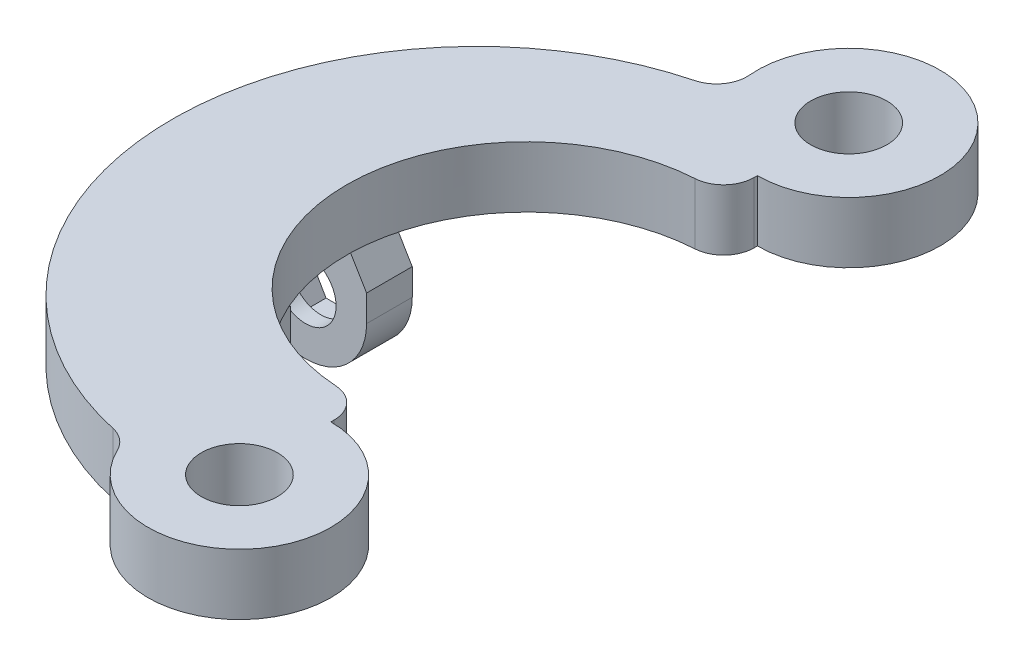
ISO-10303-21;
HEADER;
FILE_DESCRIPTION(('STEP AP214'),'2;1');
FILE_NAME('part.step','',(''),(''),'','','');
FILE_SCHEMA(('AUTOMOTIVE_DESIGN { 1 0 10303 214 1 1 1 1 }'));
ENDSEC;
DATA;
#1=APPLICATION_CONTEXT('core data for automotive mechanical design processes');
#2=APPLICATION_PROTOCOL_DEFINITION('international standard','automotive_design',2000,#1);
#3=PRODUCT_CONTEXT('',#1,'mechanical');
#4=PRODUCT('Part','Part','',(#3));
#5=PRODUCT_RELATED_PRODUCT_CATEGORY('part','',(#4));
#6=PRODUCT_DEFINITION_FORMATION('','',#4);
#7=PRODUCT_DEFINITION_CONTEXT('part definition',#1,'design');
#8=PRODUCT_DEFINITION('design','',#6,#7);
#9=PRODUCT_DEFINITION_SHAPE('','',#8);
#10=(LENGTH_UNIT() NAMED_UNIT(*) SI_UNIT(.MILLI.,.METRE.));
#11=(NAMED_UNIT(*) PLANE_ANGLE_UNIT() SI_UNIT($,.RADIAN.));
#12=(NAMED_UNIT(*) SI_UNIT($,.STERADIAN.) SOLID_ANGLE_UNIT());
#13=UNCERTAINTY_MEASURE_WITH_UNIT(LENGTH_MEASURE(1.E-05),#10,'distance_accuracy_value','');
#14=(GEOMETRIC_REPRESENTATION_CONTEXT(3) GLOBAL_UNCERTAINTY_ASSIGNED_CONTEXT((#13)) GLOBAL_UNIT_ASSIGNED_CONTEXT((#10,
#11,#12)) REPRESENTATION_CONTEXT('',''));
#15=CARTESIAN_POINT('',(0.,0.,0.));
#16=DIRECTION('',(0.,0.,1.));
#17=DIRECTION('',(1.,0.,0.));
#18=AXIS2_PLACEMENT_3D('',#15,#16,#17);
#19=CARTESIAN_POINT('',(7.00000000000001,1.77089805895925,23.7588900000001));
#20=DIRECTION('',(1.,0.,0.));
#21=DIRECTION('',(0.,0.,-1.));
#22=AXIS2_PLACEMENT_3D('',#19,#20,#21);
#23=PLANE('',#22);
#24=DIRECTION('',(0.,0.,-1.));
#25=VECTOR('',#24,1.);
#26=CARTESIAN_POINT('',(7.00000000000001,5.77089805895925,23.7588900000001));
#27=LINE('',#26,#25);
#28=CARTESIAN_POINT('',(6.99999999999995,5.77089805895925,-4.0244528735884));
#29=VERTEX_POINT('',#28);
#30=CARTESIAN_POINT('',(6.99999999999995,5.77089805895925,-4.24110999999981));
#31=VERTEX_POINT('',#30);
#32=EDGE_CURVE('E333',#29,#31,#27,.T.);
#33=ORIENTED_EDGE('',*,*,#32,.F.);
#34=DIRECTION('',(0.,-1.,0.));
#35=VECTOR('',#34,1.);
#36=CARTESIAN_POINT('',(6.99999999999995,1.77089805895924,-4.0244528735884));
#37=LINE('',#36,#35);
#38=CARTESIAN_POINT('',(6.99999999999995,1.77089805895925,-4.0244528735884));
#39=VERTEX_POINT('',#38);
#40=EDGE_CURVE('E374',#29,#39,#37,.T.);
#41=ORIENTED_EDGE('',*,*,#40,.T.);
#42=DIRECTION('',(0.,0.,-1.));
#43=VECTOR('',#42,1.);
#44=CARTESIAN_POINT('',(7.00000000000001,1.77089805895925,23.7588900000001));
#45=LINE('',#44,#43);
#46=CARTESIAN_POINT('',(6.99999999999995,1.77089805895925,-4.24110999999981));
#47=VERTEX_POINT('',#46);
#48=EDGE_CURVE('E322',#39,#47,#45,.T.);
#49=ORIENTED_EDGE('',*,*,#48,.T.);
#50=DIRECTION('',(0.,1.,0.));
#51=VECTOR('',#50,1.);
#52=CARTESIAN_POINT('',(6.99999999999995,1.77089805895925,-4.24110999999981));
#53=LINE('',#52,#51);
#54=EDGE_CURVE('E338',#47,#31,#53,.T.);
#55=ORIENTED_EDGE('',*,*,#54,.T.);
#56=EDGE_LOOP('',(#33,#41,#49,#55));
#57=FACE_BOUND('',#56,.T.);
#58=ADVANCED_FACE('F32',(#57),#23,.T.);
#59=CARTESIAN_POINT('',(-8.91305160522469,-1.66053485870361,14.5));
#60=DIRECTION('',(0.,0.,1.));
#61=DIRECTION('',(1.,0.,0.));
#62=AXIS2_PLACEMENT_3D('',#59,#60,#61);
#63=PLANE('',#62);
#64=CARTESIAN_POINT('',(-8.91305160522469,-1.66053485870361,14.5));
#65=DIRECTION('',(0.,0.,1.));
#66=DIRECTION('',(1.,0.,0.));
#67=AXIS2_PLACEMENT_3D('',#64,#65,#66);
#68=CIRCLE('',#67,4.00000000000001);
#69=CARTESIAN_POINT('',(-12.9130516052247,-1.66053485870361,14.5));
#70=VERTEX_POINT('',#69);
#71=CARTESIAN_POINT('',(-4.91305160522469,-1.66053485870361,14.5));
#72=VERTEX_POINT('',#71);
#73=EDGE_CURVE('E272',#70,#72,#68,.T.);
#74=ORIENTED_EDGE('',*,*,#73,.F.);
#75=DIRECTION('',(0.,-1.,0.));
#76=VECTOR('',#75,1.);
#77=CARTESIAN_POINT('',(-12.9130516052247,1.77089805895931,14.5));
#78=LINE('',#77,#76);
#79=CARTESIAN_POINT('',(-12.9130516052247,1.77089805895931,14.5));
#80=VERTEX_POINT('',#79);
#81=EDGE_CURVE('E284',#80,#70,#78,.T.);
#82=ORIENTED_EDGE('',*,*,#81,.F.);
#83=CARTESIAN_POINT('',(-4.91305160522469,1.77089805895931,14.5));
#84=CARTESIAN_POINT('',(-12.9130516052247,1.77089805895931,14.5));
#85=B_SPLINE_CURVE_WITH_KNOTS('',1,(#83,#84),.UNSPECIFIED.,.F.,.F.,(2,2),(0.,1.),.UNSPECIFIED.);
#86=CARTESIAN_POINT('',(-4.97155154017328,1.77089805895924,14.5));
#87=VERTEX_POINT('',#86);
#88=EDGE_CURVE('E279',#87,#80,#85,.T.);
#89=ORIENTED_EDGE('',*,*,#88,.F.);
#90=CARTESIAN_POINT('',(-4.91305160522469,1.77089805895927,14.5));
#91=VERTEX_POINT('',#90);
#92=EDGE_CURVE('E280',#91,#87,#85,.T.);
#93=ORIENTED_EDGE('',*,*,#92,.F.);
#94=DIRECTION('',(0.,1.,0.));
#95=VECTOR('',#94,1.);
#96=CARTESIAN_POINT('',(-4.91305160522469,-1.66053485870361,14.5));
#97=LINE('',#96,#95);
#98=EDGE_CURVE('E275',#72,#91,#97,.T.);
#99=ORIENTED_EDGE('',*,*,#98,.F.);
#100=EDGE_LOOP('',(#74,#82,#89,#93,#99));
#101=FACE_BOUND('',#100,.T.);
#102=CARTESIAN_POINT('',(-8.91305160522469,-1.72910194104063,14.5));
#103=DIRECTION('',(0.,0.,-1.));
#104=DIRECTION('',(-1.,0.,0.));
#105=AXIS2_PLACEMENT_3D('',#102,#103,#104);
#106=CIRCLE('',#105,1.99999999999997);
#107=CARTESIAN_POINT('',(-10.9130516052247,-1.72910194104063,14.5));
#108=VERTEX_POINT('',#107);
#109=EDGE_CURVE('E219',#108,#108,#106,.T.);
#110=ORIENTED_EDGE('',*,*,#109,.F.);
#111=EDGE_LOOP('',(#110));
#112=FACE_BOUND('',#111,.T.);
#113=ADVANCED_FACE('F504',(#101,#112),#63,.F.);
#114=CARTESIAN_POINT('',(4.58488464355469,1.77089805895925,11.7612838745118));
#115=DIRECTION('',(0.,1.,0.));
#116=DIRECTION('',(0.,0.,1.));
#117=AXIS2_PLACEMENT_3D('',#114,#115,#116);
#118=PLANE('',#117);
#119=CARTESIAN_POINT('',(6.99999999999999,1.77089805895925,29.7588900000001));
#120=DIRECTION('',(0.,1.,0.));
#121=DIRECTION('',(0.,0.,1.));
#122=AXIS2_PLACEMENT_3D('',#119,#120,#121);
#123=CIRCLE('',#122,2.49999999999998);
#124=CARTESIAN_POINT('',(6.99999999999999,1.77089805895925,32.2588900000001));
#125=VERTEX_POINT('',#124);
#126=EDGE_CURVE('E349',#125,#125,#123,.T.);
#127=ORIENTED_EDGE('',*,*,#126,.T.);
#128=EDGE_LOOP('',(#127));
#129=FACE_BOUND('',#128,.T.);
#130=CARTESIAN_POINT('',(6.99999999999999,1.77089805895925,-10.2411099999999));
#131=DIRECTION('',(0.,1.,0.));
#132=DIRECTION('',(0.,0.,1.));
#133=AXIS2_PLACEMENT_3D('',#130,#131,#132);
#134=CIRCLE('',#133,2.49999999999998);
#135=CARTESIAN_POINT('',(6.99999999999999,1.77089805895925,-7.74110999999994));
#136=VERTEX_POINT('',#135);
#137=EDGE_CURVE('E344',#136,#136,#134,.T.);
#138=ORIENTED_EDGE('',*,*,#137,.T.);
#139=EDGE_LOOP('',(#138));
#140=FACE_BOUND('',#139,.T.);
#141=CARTESIAN_POINT('',(5.84409713745117,1.77089805895924,9.75888999999987));
#142=DIRECTION('',(0.,1.,0.));
#143=DIRECTION('',(0.,0.,1.));
#144=AXIS2_PLACEMENT_3D('',#141,#142,#143);
#145=CIRCLE('',#144,11.8091650996123);
#146=CARTESIAN_POINT('',(-4.91305160522469,1.77089805895924,14.6312745576727));
#147=VERTEX_POINT('',#146);
#148=CARTESIAN_POINT('',(5.12225172649649,1.77089805895924,21.5459727413988));
#149=VERTEX_POINT('',#148);
#150=EDGE_CURVE('E223',#147,#149,#145,.T.);
#151=ORIENTED_EDGE('',*,*,#150,.T.);
#152=CARTESIAN_POINT('',(5.00000000000003,1.77089805895925,23.5422328735881));
#153=DIRECTION('',(0.,1.,0.));
#154=DIRECTION('',(0.,0.,1.));
#155=AXIS2_PLACEMENT_3D('',#152,#153,#154);
#156=CIRCLE('',#155,1.99999999999998);
#157=CARTESIAN_POINT('',(7.00000000000001,1.77089805895925,23.5422328735881));
#158=VERTEX_POINT('',#157);
#159=EDGE_CURVE('E368',#149,#158,#156,.F.);
#160=ORIENTED_EDGE('',*,*,#159,.T.);
#161=CARTESIAN_POINT('',(7.00000000000001,1.77089805895925,23.7588900000001));
#162=VERTEX_POINT('',#161);
#163=EDGE_CURVE('E323',#162,#158,#45,.T.);
#164=ORIENTED_EDGE('',*,*,#163,.F.);
#165=CARTESIAN_POINT('',(6.99999999999999,1.77089805895925,29.7588900000001));
#166=DIRECTION('',(0.,1.,0.));
#167=DIRECTION('',(0.,0.,1.));
#168=AXIS2_PLACEMENT_3D('',#165,#166,#167);
#169=CIRCLE('',#168,5.99999999999998);
#170=CARTESIAN_POINT('',(1.59538059948465,1.77089805895925,32.3646699476497));
#171=VERTEX_POINT('',#170);
#172=EDGE_CURVE('E319',#171,#162,#169,.T.);
#173=ORIENTED_EDGE('',*,*,#172,.F.);
#174=CARTESIAN_POINT('',(-0.206159200687123,1.77089805895925,33.2332632635329));
#175=DIRECTION('',(0.,1.,0.));
#176=DIRECTION('',(0.,0.,1.));
#177=AXIS2_PLACEMENT_3D('',#174,#175,#176);
#178=CIRCLE('',#177,1.99999999999998);
#179=CARTESIAN_POINT('',(0.229390239698494,1.77089805895925,31.2812651372583));
#180=VERTEX_POINT('',#179);
#181=EDGE_CURVE('E378',#171,#180,#178,.T.);
#182=ORIENTED_EDGE('',*,*,#181,.T.);
#183=CARTESIAN_POINT('',(4.58488464355469,1.77089805895925,11.7612838745118));
#184=DIRECTION('',(0.,1.,0.));
#185=DIRECTION('',(0.,0.,1.));
#186=AXIS2_PLACEMENT_3D('',#183,#184,#185);
#187=CIRCLE('',#186,19.9999999999999);
#188=CARTESIAN_POINT('',(-0.463201513317756,1.77089805895925,-7.59115334028859));
#189=VERTEX_POINT('',#188);
#190=EDGE_CURVE('E316',#189,#180,#187,.T.);
#191=ORIENTED_EDGE('',*,*,#190,.F.);
#192=CARTESIAN_POINT('',(-0.968010129004998,1.77089805895925,-9.52639706176861));
#193=DIRECTION('',(0.,1.,0.));
#194=DIRECTION('',(0.,0.,1.));
#195=AXIS2_PLACEMENT_3D('',#192,#193,#194);
#196=CIRCLE('',#195,1.99999999999998);
#197=CARTESIAN_POINT('',(1.02399240324621,1.77089805895925,-9.70507529632644));
#198=VERTEX_POINT('',#197);
#199=EDGE_CURVE('E11',#189,#198,#196,.T.);
#200=ORIENTED_EDGE('',*,*,#199,.T.);
#201=CARTESIAN_POINT('',(6.99999999999999,1.77089805895925,-10.2411099999999));
#202=DIRECTION('',(0.,1.,0.));
#203=DIRECTION('',(0.,0.,1.));
#204=AXIS2_PLACEMENT_3D('',#201,#202,#203);
#205=CIRCLE('',#204,6.0000000000001);
#206=EDGE_CURVE('E325',#47,#198,#205,.T.);
#207=ORIENTED_EDGE('',*,*,#206,.F.);
#208=ORIENTED_EDGE('',*,*,#48,.F.);
#209=CARTESIAN_POINT('',(4.99999999999997,1.77089805895925,-4.0244528735884));
#210=DIRECTION('',(0.,1.,0.));
#211=DIRECTION('',(0.,0.,1.));
#212=AXIS2_PLACEMENT_3D('',#209,#210,#211);
#213=CIRCLE('',#212,1.99999999999998);
#214=CARTESIAN_POINT('',(5.12225172649644,1.77089805895924,-2.02819274139907));
#215=VERTEX_POINT('',#214);
#216=EDGE_CURVE('E215',#39,#215,#213,.F.);
#217=ORIENTED_EDGE('',*,*,#216,.T.);
#218=CARTESIAN_POINT('',(-5.96222982387771,1.77089805895924,9.50000000000008));
#219=VERTEX_POINT('',#218);
#220=EDGE_CURVE('E206',#215,#219,#145,.T.);
#221=ORIENTED_EDGE('',*,*,#220,.T.);
#222=DIRECTION('',(0.,0.,1.));
#223=VECTOR('',#222,1.);
#224=CARTESIAN_POINT('',(-5.9622298183957,1.77089805895928,6.50000000000007));
#225=LINE('',#224,#223);
#226=CARTESIAN_POINT('',(-5.9622298183957,1.77089805895928,6.50000000000007));
#227=VERTEX_POINT('',#226);
#228=EDGE_CURVE('E212',#227,#219,#225,.T.);
#229=ORIENTED_EDGE('',*,*,#228,.F.);
#230=CARTESIAN_POINT('',(-5.9622298183957,1.77089805895928,6.50000000000007));
#231=CARTESIAN_POINT('',(-12.9130516052246,1.77089805895928,6.50000000000007));
#232=B_SPLINE_CURVE_WITH_KNOTS('',1,(#230,#231),.UNSPECIFIED.,.F.,.F.,(2,2),(0.,1.),.UNSPECIFIED.);
#233=CARTESIAN_POINT('',(-12.9130516052246,1.77089805895928,6.50000000000007));
#234=VERTEX_POINT('',#233);
#235=EDGE_CURVE('E472',#227,#234,#232,.T.);
#236=ORIENTED_EDGE('',*,*,#235,.T.);
#237=DIRECTION('',(0.,0.,1.));
#238=VECTOR('',#237,1.);
#239=CARTESIAN_POINT('',(-12.9130516052246,1.77089805895928,6.50000000000007));
#240=LINE('',#239,#238);
#241=CARTESIAN_POINT('',(-12.9130516052246,1.77089805895928,9.50000000000008));
#242=VERTEX_POINT('',#241);
#243=EDGE_CURVE('E249',#234,#242,#240,.T.);
#244=ORIENTED_EDGE('',*,*,#243,.T.);
#245=CARTESIAN_POINT('',(-5.9622298183957,1.77089805895928,9.50000000000008));
#246=CARTESIAN_POINT('',(-12.9130516052246,1.77089805895928,9.50000000000008));
#247=B_SPLINE_CURVE_WITH_KNOTS('',1,(#245,#246),.UNSPECIFIED.,.F.,.F.,(2,2),(0.,1.),.UNSPECIFIED.);
#248=EDGE_CURVE('E239',#219,#242,#247,.T.);
#249=ORIENTED_EDGE('',*,*,#248,.F.);
#250=EDGE_CURVE('E220',#219,#87,#145,.T.);
#251=ORIENTED_EDGE('',*,*,#250,.T.);
#252=ORIENTED_EDGE('',*,*,#88,.T.);
#253=DIRECTION('',(0.,0.,1.));
#254=VECTOR('',#253,1.);
#255=CARTESIAN_POINT('',(-12.9130516052247,1.77089805895931,14.5));
#256=LINE('',#255,#254);
#257=CARTESIAN_POINT('',(-12.9130516052247,1.77089805895931,17.5));
#258=VERTEX_POINT('',#257);
#259=EDGE_CURVE('E308',#80,#258,#256,.T.);
#260=ORIENTED_EDGE('',*,*,#259,.T.);
#261=CARTESIAN_POINT('',(-4.91305160522469,1.77089805895931,17.5));
#262=CARTESIAN_POINT('',(-12.9130516052247,1.77089805895931,17.5));
#263=B_SPLINE_CURVE_WITH_KNOTS('',1,(#261,#262),.UNSPECIFIED.,.F.,.F.,(2,2),(0.,1.),.UNSPECIFIED.);
#264=CARTESIAN_POINT('',(-4.91305160522468,1.77089805895925,17.5));
#265=VERTEX_POINT('',#264);
#266=EDGE_CURVE('E296',#265,#258,#263,.T.);
#267=ORIENTED_EDGE('',*,*,#266,.F.);
#268=DIRECTION('',(0.,0.,1.));
#269=VECTOR('',#268,1.);
#270=CARTESIAN_POINT('',(-4.91305160522469,1.77089805895931,14.5));
#271=LINE('',#270,#269);
#272=EDGE_CURVE('E314',#147,#265,#271,.T.);
#273=ORIENTED_EDGE('',*,*,#272,.F.);
#274=EDGE_LOOP('',(#151,#160,#164,#173,#182,#191,#200,#207,#208,#217,#221,#229,#236,#244,#249,
#251,#252,#260,#267,#273));
#275=FACE_BOUND('',#274,.T.);
#276=ADVANCED_FACE('F209',(#129,#140,#275),#118,.F.);
#277=CARTESIAN_POINT('',(4.58488464355469,1.77089805895925,11.7612838745118));
#278=DIRECTION('',(0.,1.,0.));
#279=DIRECTION('',(0.,0.,1.));
#280=AXIS2_PLACEMENT_3D('',#277,#278,#279);
#281=CYLINDRICAL_SURFACE('',#280,19.9999999999999);
#282=ORIENTED_EDGE('',*,*,#190,.T.);
#283=DIRECTION('',(0.,1.,0.));
#284=VECTOR('',#283,1.);
#285=CARTESIAN_POINT('',(0.229390239698493,1.77089805895925,31.2812651372583));
#286=LINE('',#285,#284);
#287=CARTESIAN_POINT('',(0.229390239698494,5.77089805895925,31.2812651372583));
#288=VERTEX_POINT('',#287);
#289=EDGE_CURVE('E354',#180,#288,#286,.T.);
#290=ORIENTED_EDGE('',*,*,#289,.T.);
#291=CARTESIAN_POINT('',(4.58488464355469,5.77089805895925,11.7612838745118));
#292=DIRECTION('',(0.,1.,0.));
#293=DIRECTION('',(0.,0.,1.));
#294=AXIS2_PLACEMENT_3D('',#291,#292,#293);
#295=CIRCLE('',#294,19.9999999999999);
#296=CARTESIAN_POINT('',(-0.463201513317756,5.77089805895925,-7.59115334028859));
#297=VERTEX_POINT('',#296);
#298=EDGE_CURVE('E307',#297,#288,#295,.T.);
#299=ORIENTED_EDGE('',*,*,#298,.F.);
#300=DIRECTION('',(0.,1.,0.));
#301=VECTOR('',#300,1.);
#302=CARTESIAN_POINT('',(-0.463201513317755,1.77089805895925,-7.59115334028859));
#303=LINE('',#302,#301);
#304=EDGE_CURVE('E341',#297,#189,#303,.F.);
#305=ORIENTED_EDGE('',*,*,#304,.T.);
#306=EDGE_LOOP('',(#282,#290,#299,#305));
#307=FACE_BOUND('',#306,.T.);
#308=ADVANCED_FACE('F387',(#307),#281,.T.);
#309=CARTESIAN_POINT('',(6.99999999999999,1.77089805895925,-10.2411099999999));
#310=DIRECTION('',(0.,1.,0.));
#311=DIRECTION('',(0.,0.,1.));
#312=AXIS2_PLACEMENT_3D('',#309,#310,#311);
#313=CYLINDRICAL_SURFACE('',#312,6.0000000000001);
#314=ORIENTED_EDGE('',*,*,#206,.T.);
#315=DIRECTION('',(0.,1.,0.));
#316=VECTOR('',#315,1.);
#317=CARTESIAN_POINT('',(1.02399240324621,1.77089805895925,-9.70507529632644));
#318=LINE('',#317,#316);
#319=CARTESIAN_POINT('',(1.02399240324621,5.77089805895925,-9.70507529632644));
#320=VERTEX_POINT('',#319);
#321=EDGE_CURVE('E359',#198,#320,#318,.T.);
#322=ORIENTED_EDGE('',*,*,#321,.T.);
#323=CARTESIAN_POINT('',(6.99999999999999,5.77089805895925,-10.2411099999999));
#324=DIRECTION('',(0.,1.,0.));
#325=DIRECTION('',(0.,0.,1.));
#326=AXIS2_PLACEMENT_3D('',#323,#324,#325);
#327=CIRCLE('',#326,6.0000000000001);
#328=EDGE_CURVE('E320',#31,#320,#327,.T.);
#329=ORIENTED_EDGE('',*,*,#328,.F.);
#330=ORIENTED_EDGE('',*,*,#54,.F.);
#331=EDGE_LOOP('',(#314,#322,#329,#330));
#332=FACE_BOUND('',#331,.T.);
#333=ADVANCED_FACE('F395',(#332),#313,.T.);
#334=ORIENTED_EDGE('',*,*,#163,.T.);
#335=DIRECTION('',(0.,-1.,0.));
#336=VECTOR('',#335,1.);
#337=CARTESIAN_POINT('',(7.00000000000001,5.77089805895925,23.5422328735881));
#338=LINE('',#337,#336);
#339=CARTESIAN_POINT('',(7.00000000000001,5.77089805895925,23.5422328735881));
#340=VERTEX_POINT('',#339);
#341=EDGE_CURVE('E55',#158,#340,#338,.F.);
#342=ORIENTED_EDGE('',*,*,#341,.T.);
#343=CARTESIAN_POINT('',(7.00000000000001,5.77089805895925,23.7588900000001));
#344=VERTEX_POINT('',#343);
#345=EDGE_CURVE('E334',#344,#340,#27,.T.);
#346=ORIENTED_EDGE('',*,*,#345,.F.);
#347=DIRECTION('',(0.,1.,0.));
#348=VECTOR('',#347,1.);
#349=CARTESIAN_POINT('',(7.00000000000001,1.77089805895925,23.7588900000001));
#350=LINE('',#349,#348);
#351=EDGE_CURVE('E328',#162,#344,#350,.T.);
#352=ORIENTED_EDGE('',*,*,#351,.F.);
#353=EDGE_LOOP('',(#334,#342,#346,#352));
#354=FACE_BOUND('',#353,.T.);
#355=ADVANCED_FACE('F506',(#354),#23,.T.);
#356=CARTESIAN_POINT('',(6.99999999999999,1.77089805895925,29.7588900000001));
#357=DIRECTION('',(0.,1.,0.));
#358=DIRECTION('',(0.,0.,1.));
#359=AXIS2_PLACEMENT_3D('',#356,#357,#358);
#360=CYLINDRICAL_SURFACE('',#359,5.99999999999998);
#361=CARTESIAN_POINT('',(6.99999999999999,5.77089805895925,29.7588900000001));
#362=DIRECTION('',(0.,1.,0.));
#363=DIRECTION('',(0.,0.,1.));
#364=AXIS2_PLACEMENT_3D('',#361,#362,#363);
#365=CIRCLE('',#364,5.99999999999998);
#366=CARTESIAN_POINT('',(1.59538059948465,5.77089805895925,32.3646699476497));
#367=VERTEX_POINT('',#366);
#368=EDGE_CURVE('E331',#367,#344,#365,.T.);
#369=ORIENTED_EDGE('',*,*,#368,.F.);
#370=DIRECTION('',(0.,1.,0.));
#371=VECTOR('',#370,1.);
#372=CARTESIAN_POINT('',(1.59538059948465,1.77089805895925,32.3646699476497));
#373=LINE('',#372,#371);
#374=EDGE_CURVE('E357',#367,#171,#373,.F.);
#375=ORIENTED_EDGE('',*,*,#374,.T.);
#376=ORIENTED_EDGE('',*,*,#172,.T.);
#377=ORIENTED_EDGE('',*,*,#351,.T.);
#378=EDGE_LOOP('',(#369,#375,#376,#377));
#379=FACE_BOUND('',#378,.T.);
#380=ADVANCED_FACE('F515',(#379),#360,.T.);
#381=CARTESIAN_POINT('',(4.58488464355469,5.77089805895925,11.7612838745118));
#382=DIRECTION('',(0.,1.,0.));
#383=DIRECTION('',(0.,0.,1.));
#384=AXIS2_PLACEMENT_3D('',#381,#382,#383);
#385=PLANE('',#384);
#386=ORIENTED_EDGE('',*,*,#345,.T.);
#387=CARTESIAN_POINT('',(5.00000000000003,5.77089805895925,23.5422328735881));
#388=DIRECTION('',(0.,1.,0.));
#389=DIRECTION('',(0.,0.,1.));
#390=AXIS2_PLACEMENT_3D('',#387,#388,#389);
#391=CIRCLE('',#390,1.99999999999998);
#392=CARTESIAN_POINT('',(5.12225172649649,5.77089805895925,21.5459727413988));
#393=VERTEX_POINT('',#392);
#394=EDGE_CURVE('E372',#340,#393,#391,.T.);
#395=ORIENTED_EDGE('',*,*,#394,.T.);
#396=CARTESIAN_POINT('',(5.84409713745117,5.77089805895925,9.75888999999987));
#397=DIRECTION('',(0.,1.,0.));
#398=DIRECTION('',(0.,0.,1.));
#399=AXIS2_PLACEMENT_3D('',#396,#397,#398);
#400=CIRCLE('',#399,11.8091650996123);
#401=CARTESIAN_POINT('',(5.12225172649644,5.77089805895925,-2.02819274139907));
#402=VERTEX_POINT('',#401);
#403=EDGE_CURVE('E399',#402,#393,#400,.T.);
#404=ORIENTED_EDGE('',*,*,#403,.F.);
#405=CARTESIAN_POINT('',(4.99999999999997,5.77089805895925,-4.0244528735884));
#406=DIRECTION('',(0.,1.,0.));
#407=DIRECTION('',(0.,0.,1.));
#408=AXIS2_PLACEMENT_3D('',#405,#406,#407);
#409=CIRCLE('',#408,1.99999999999998);
#410=EDGE_CURVE('E47',#402,#29,#409,.T.);
#411=ORIENTED_EDGE('',*,*,#410,.T.);
#412=ORIENTED_EDGE('',*,*,#32,.T.);
#413=ORIENTED_EDGE('',*,*,#328,.T.);
#414=CARTESIAN_POINT('',(-0.968010129004998,5.77089805895925,-9.52639706176861));
#415=DIRECTION('',(0.,1.,0.));
#416=DIRECTION('',(0.,0.,1.));
#417=AXIS2_PLACEMENT_3D('',#414,#415,#416);
#418=CIRCLE('',#417,1.99999999999998);
#419=EDGE_CURVE('E40',#320,#297,#418,.F.);
#420=ORIENTED_EDGE('',*,*,#419,.T.);
#421=ORIENTED_EDGE('',*,*,#298,.T.);
#422=CARTESIAN_POINT('',(-0.206159200687123,5.77089805895925,33.2332632635329));
#423=DIRECTION('',(0.,1.,0.));
#424=DIRECTION('',(0.,0.,1.));
#425=AXIS2_PLACEMENT_3D('',#422,#423,#424);
#426=CIRCLE('',#425,1.99999999999998);
#427=EDGE_CURVE('E376',#288,#367,#426,.F.);
#428=ORIENTED_EDGE('',*,*,#427,.T.);
#429=ORIENTED_EDGE('',*,*,#368,.T.);
#430=EDGE_LOOP('',(#386,#395,#404,#411,#412,#413,#420,#421,#428,#429));
#431=FACE_BOUND('',#430,.T.);
#432=CARTESIAN_POINT('',(6.99999999999999,5.77089805895925,29.7588900000001));
#433=DIRECTION('',(0.,1.,0.));
#434=DIRECTION('',(0.,0.,1.));
#435=AXIS2_PLACEMENT_3D('',#432,#433,#434);
#436=CIRCLE('',#435,2.49999999999997);
#437=CARTESIAN_POINT('',(6.99999999999999,5.77089805895925,32.2588900000001));
#438=VERTEX_POINT('',#437);
#439=EDGE_CURVE('E352',#438,#438,#436,.T.);
#440=ORIENTED_EDGE('',*,*,#439,.F.);
#441=EDGE_LOOP('',(#440));
#442=FACE_BOUND('',#441,.T.);
#443=CARTESIAN_POINT('',(6.99999999999999,5.77089805895925,-10.2411099999999));
#444=DIRECTION('',(0.,1.,0.));
#445=DIRECTION('',(0.,0.,1.));
#446=AXIS2_PLACEMENT_3D('',#443,#444,#445);
#447=CIRCLE('',#446,2.49999999999997);
#448=CARTESIAN_POINT('',(6.99999999999999,5.77089805895925,-7.74110999999994));
#449=VERTEX_POINT('',#448);
#450=EDGE_CURVE('E348',#449,#449,#447,.T.);
#451=ORIENTED_EDGE('',*,*,#450,.F.);
#452=EDGE_LOOP('',(#451));
#453=FACE_BOUND('',#452,.T.);
#454=ADVANCED_FACE('F380',(#431,#442,#453),#385,.T.);
#455=CARTESIAN_POINT('',(-8.91305160522469,-1.66053485870361,14.5));
#456=DIRECTION('',(0.,0.,1.));
#457=DIRECTION('',(1.,0.,0.));
#458=AXIS2_PLACEMENT_3D('',#455,#456,#457);
#459=CYLINDRICAL_SURFACE('',#458,4.00000000000001);
#460=CARTESIAN_POINT('',(-8.91305160522469,-1.66053485870361,17.5));
#461=DIRECTION('',(0.,0.,1.));
#462=DIRECTION('',(1.,0.,0.));
#463=AXIS2_PLACEMENT_3D('',#460,#461,#462);
#464=CIRCLE('',#463,4.00000000000001);
#465=CARTESIAN_POINT('',(-12.9130516052247,-1.66053485870361,17.5));
#466=VERTEX_POINT('',#465);
#467=CARTESIAN_POINT('',(-4.91305160522469,-1.66053485870361,17.5));
#468=VERTEX_POINT('',#467);
#469=EDGE_CURVE('E266',#466,#468,#464,.T.);
#470=ORIENTED_EDGE('',*,*,#469,.F.);
#471=DIRECTION('',(0.,0.,1.));
#472=VECTOR('',#471,1.);
#473=CARTESIAN_POINT('',(-12.9130516052247,-1.66053485870361,14.5));
#474=LINE('',#473,#472);
#475=EDGE_CURVE('E305',#70,#466,#474,.T.);
#476=ORIENTED_EDGE('',*,*,#475,.F.);
#477=ORIENTED_EDGE('',*,*,#73,.T.);
#478=DIRECTION('',(0.,0.,1.));
#479=VECTOR('',#478,1.);
#480=CARTESIAN_POINT('',(-4.91305160522469,-1.66053485870361,14.5));
#481=LINE('',#480,#479);
#482=EDGE_CURVE('E290',#72,#468,#481,.T.);
#483=ORIENTED_EDGE('',*,*,#482,.T.);
#484=EDGE_LOOP('',(#470,#476,#477,#483));
#485=FACE_BOUND('',#484,.T.);
#486=ADVANCED_FACE('F545',(#485),#459,.T.);
#487=CARTESIAN_POINT('',(-12.9130516052247,1.77089805895931,14.5));
#488=DIRECTION('',(-1.,0.,0.));
#489=DIRECTION('',(0.,-1.,0.));
#490=AXIS2_PLACEMENT_3D('',#487,#488,#489);
#491=PLANE('',#490);
#492=DIRECTION('',(0.,-1.,0.));
#493=VECTOR('',#492,1.);
#494=CARTESIAN_POINT('',(-12.9130516052247,1.77089805895931,17.5));
#495=LINE('',#494,#493);
#496=EDGE_CURVE('E276',#258,#466,#495,.T.);
#497=ORIENTED_EDGE('',*,*,#496,.F.);
#498=ORIENTED_EDGE('',*,*,#259,.F.);
#499=ORIENTED_EDGE('',*,*,#81,.T.);
#500=ORIENTED_EDGE('',*,*,#475,.T.);
#501=EDGE_LOOP('',(#497,#498,#499,#500));
#502=FACE_BOUND('',#501,.T.);
#503=ADVANCED_FACE('F541',(#502),#491,.T.);
#504=CARTESIAN_POINT('',(-4.91305160522469,-1.66053485870361,14.5));
#505=DIRECTION('',(1.,0.,0.));
#506=DIRECTION('',(0.,1.,0.));
#507=AXIS2_PLACEMENT_3D('',#504,#505,#506);
#508=PLANE('',#507);
#509=DIRECTION('',(0.,1.,0.));
#510=VECTOR('',#509,1.);
#511=CARTESIAN_POINT('',(-4.91305160522469,-1.66053485870361,17.5));
#512=LINE('',#511,#510);
#513=EDGE_CURVE('E293',#468,#265,#512,.T.);
#514=ORIENTED_EDGE('',*,*,#513,.F.);
#515=ORIENTED_EDGE('',*,*,#482,.F.);
#516=ORIENTED_EDGE('',*,*,#98,.T.);
#517=EDGE_CURVE('E311',#91,#147,#271,.T.);
#518=ORIENTED_EDGE('',*,*,#517,.T.);
#519=ORIENTED_EDGE('',*,*,#272,.T.);
#520=EDGE_LOOP('',(#514,#515,#516,#518,#519));
#521=FACE_BOUND('',#520,.T.);
#522=ADVANCED_FACE('F530',(#521),#508,.T.);
#523=CARTESIAN_POINT('',(-8.91305160522469,-1.66053485870361,17.5));
#524=DIRECTION('',(0.,0.,1.));
#525=DIRECTION('',(1.,0.,0.));
#526=AXIS2_PLACEMENT_3D('',#523,#524,#525);
#527=PLANE('',#526);
#528=CARTESIAN_POINT('',(-8.91305160522469,-1.72910194104063,17.5));
#529=DIRECTION('',(0.,0.,1.));
#530=DIRECTION('',(1.,0.,0.));
#531=AXIS2_PLACEMENT_3D('',#528,#529,#530);
#532=CIRCLE('',#531,1.99999999999997);
#533=CARTESIAN_POINT('',(-6.91305160522472,-1.72910194104063,17.5));
#534=VERTEX_POINT('',#533);
#535=EDGE_CURVE('E411',#534,#534,#532,.T.);
#536=ORIENTED_EDGE('',*,*,#535,.F.);
#537=EDGE_LOOP('',(#536));
#538=FACE_BOUND('',#537,.T.);
#539=ORIENTED_EDGE('',*,*,#469,.T.);
#540=ORIENTED_EDGE('',*,*,#513,.T.);
#541=ORIENTED_EDGE('',*,*,#266,.T.);
#542=ORIENTED_EDGE('',*,*,#496,.T.);
#543=EDGE_LOOP('',(#539,#540,#541,#542));
#544=FACE_BOUND('',#543,.T.);
#545=ADVANCED_FACE('F500',(#538,#544),#527,.T.);
#546=CARTESIAN_POINT('',(-8.91305160528576,-1.72910194104064,6.50000000000007));
#547=DIRECTION('',(0.,0.,1.));
#548=DIRECTION('',(1.,0.,0.));
#549=AXIS2_PLACEMENT_3D('',#546,#547,#548);
#550=CYLINDRICAL_SURFACE('',#549,3.99999999993885);
#551=CARTESIAN_POINT('',(-8.91305160528576,-1.72910194104064,9.50000000000008));
#552=DIRECTION('',(0.,0.,1.));
#553=DIRECTION('',(1.,0.,0.));
#554=AXIS2_PLACEMENT_3D('',#551,#552,#553);
#555=CIRCLE('',#554,3.99999999993885);
#556=CARTESIAN_POINT('',(-12.9130516052246,-1.72910194104064,9.50000000000008));
#557=VERTEX_POINT('',#556);
#558=CARTESIAN_POINT('',(-4.91305160534691,-1.72910194104064,9.50000000000008));
#559=VERTEX_POINT('',#558);
#560=EDGE_CURVE('E455',#557,#559,#555,.T.);
#561=ORIENTED_EDGE('',*,*,#560,.F.);
#562=DIRECTION('',(0.,0.,1.));
#563=VECTOR('',#562,1.);
#564=CARTESIAN_POINT('',(-12.9130516052246,-1.72910194104064,6.50000000000007));
#565=LINE('',#564,#563);
#566=CARTESIAN_POINT('',(-12.9130516052246,-1.72910194104064,6.50000000000007));
#567=VERTEX_POINT('',#566);
#568=EDGE_CURVE('E264',#567,#557,#565,.T.);
#569=ORIENTED_EDGE('',*,*,#568,.F.);
#570=CARTESIAN_POINT('',(-8.91305160528576,-1.72910194104064,6.50000000000007));
#571=DIRECTION('',(0.,0.,1.));
#572=DIRECTION('',(1.,0.,0.));
#573=AXIS2_PLACEMENT_3D('',#570,#571,#572);
#574=CIRCLE('',#573,3.99999999993885);
#575=CARTESIAN_POINT('',(-4.91305160534691,-1.72910194104064,6.50000000000007));
#576=VERTEX_POINT('',#575);
#577=EDGE_CURVE('E255',#567,#576,#574,.T.);
#578=ORIENTED_EDGE('',*,*,#577,.T.);
#579=DIRECTION('',(0.,0.,1.));
#580=VECTOR('',#579,1.);
#581=CARTESIAN_POINT('',(-4.91305160534691,-1.72910194104064,6.50000000000007));
#582=LINE('',#581,#580);
#583=EDGE_CURVE('E269',#576,#559,#582,.T.);
#584=ORIENTED_EDGE('',*,*,#583,.T.);
#585=EDGE_LOOP('',(#561,#569,#578,#584));
#586=FACE_BOUND('',#585,.T.);
#587=ADVANCED_FACE('F483',(#586),#550,.T.);
#588=CARTESIAN_POINT('',(-12.9130516052246,1.77089805895928,6.50000000000007));
#589=DIRECTION('',(-1.,0.,0.));
#590=DIRECTION('',(0.,0.,1.));
#591=AXIS2_PLACEMENT_3D('',#588,#589,#590);
#592=PLANE('',#591);
#593=DIRECTION('',(0.,-1.,0.));
#594=VECTOR('',#593,1.);
#595=CARTESIAN_POINT('',(-12.9130516052246,1.77089805895928,9.50000000000008));
#596=LINE('',#595,#594);
#597=EDGE_CURVE('E253',#242,#557,#596,.T.);
#598=ORIENTED_EDGE('',*,*,#597,.F.);
#599=ORIENTED_EDGE('',*,*,#243,.F.);
#600=DIRECTION('',(0.,-1.,0.));
#601=VECTOR('',#600,1.);
#602=CARTESIAN_POINT('',(-12.9130516052246,1.77089805895928,6.50000000000007));
#603=LINE('',#602,#601);
#604=EDGE_CURVE('E271',#234,#567,#603,.T.);
#605=ORIENTED_EDGE('',*,*,#604,.T.);
#606=ORIENTED_EDGE('',*,*,#568,.T.);
#607=EDGE_LOOP('',(#598,#599,#605,#606));
#608=FACE_BOUND('',#607,.T.);
#609=ADVANCED_FACE('F492',(#608),#592,.T.);
#610=CARTESIAN_POINT('',(-4.91305160534691,0.0112560397810228,6.50000000000007));
#611=DIRECTION('',(0.85891243789311,0.512122469759447,0.));
#612=DIRECTION('',(-0.512122469759447,0.85891243789311,0.));
#613=AXIS2_PLACEMENT_3D('',#610,#611,#612);
#614=PLANE('',#613);
#615=DIRECTION('',(-0.512122469759447,0.85891243789311,0.));
#616=VECTOR('',#615,1.);
#617=CARTESIAN_POINT('',(-4.91305160534691,0.0112560397810228,9.50000000000008));
#618=LINE('',#617,#616);
#619=CARTESIAN_POINT('',(-4.91305160534691,0.0112560397810228,9.50000000000008));
#620=VERTEX_POINT('',#619);
#621=EDGE_CURVE('E235',#620,#219,#618,.T.);
#622=ORIENTED_EDGE('',*,*,#621,.F.);
#623=DIRECTION('',(0.,0.,1.));
#624=VECTOR('',#623,1.);
#625=CARTESIAN_POINT('',(-4.91305160534691,0.0112560397810228,6.50000000000007));
#626=LINE('',#625,#624);
#627=CARTESIAN_POINT('',(-4.91305160534691,0.0112560397810228,6.50000000000007));
#628=VERTEX_POINT('',#627);
#629=EDGE_CURVE('E250',#628,#620,#626,.T.);
#630=ORIENTED_EDGE('',*,*,#629,.F.);
#631=DIRECTION('',(-0.512122469759447,0.85891243789311,0.));
#632=VECTOR('',#631,1.);
#633=CARTESIAN_POINT('',(-4.91305160534691,0.0112560397810228,6.50000000000007));
#634=LINE('',#633,#632);
#635=EDGE_CURVE('E248',#628,#227,#634,.T.);
#636=ORIENTED_EDGE('',*,*,#635,.T.);
#637=ORIENTED_EDGE('',*,*,#228,.T.);
#638=EDGE_LOOP('',(#622,#630,#636,#637));
#639=FACE_BOUND('',#638,.T.);
#640=ADVANCED_FACE('F246',(#639),#614,.T.);
#641=CARTESIAN_POINT('',(-4.91305160534691,-1.72910194104064,6.50000000000007));
#642=DIRECTION('',(1.,0.,0.));
#643=DIRECTION('',(0.,0.,-1.));
#644=AXIS2_PLACEMENT_3D('',#641,#642,#643);
#645=PLANE('',#644);
#646=DIRECTION('',(0.,1.,0.));
#647=VECTOR('',#646,1.);
#648=CARTESIAN_POINT('',(-4.91305160534691,-1.72910194104064,9.50000000000008));
#649=LINE('',#648,#647);
#650=EDGE_CURVE('E242',#559,#620,#649,.T.);
#651=ORIENTED_EDGE('',*,*,#650,.F.);
#652=ORIENTED_EDGE('',*,*,#583,.F.);
#653=DIRECTION('',(0.,1.,0.));
#654=VECTOR('',#653,1.);
#655=CARTESIAN_POINT('',(-4.91305160534691,-1.72910194104064,6.50000000000007));
#656=LINE('',#655,#654);
#657=EDGE_CURVE('E468',#576,#628,#656,.T.);
#658=ORIENTED_EDGE('',*,*,#657,.T.);
#659=ORIENTED_EDGE('',*,*,#629,.T.);
#660=EDGE_LOOP('',(#651,#652,#658,#659));
#661=FACE_BOUND('',#660,.T.);
#662=ADVANCED_FACE('F487',(#661),#645,.T.);
#663=CARTESIAN_POINT('',(-8.91305160528576,-1.72910194104064,6.50000000000007));
#664=DIRECTION('',(0.,0.,1.));
#665=DIRECTION('',(1.,0.,0.));
#666=AXIS2_PLACEMENT_3D('',#663,#664,#665);
#667=PLANE('',#666);
#668=DIRECTION('',(0.500000000000001,-0.866025403784438,0.));
#669=VECTOR('',#668,1.);
#670=CARTESIAN_POINT('',(-7.25316958130447,1.14589805895936,6.50000000000007));
#671=LINE('',#670,#669);
#672=CARTESIAN_POINT('',(-7.25316958130447,1.14589805895936,6.50000000000007));
#673=VERTEX_POINT('',#672);
#674=CARTESIAN_POINT('',(-5.59328755738429,-1.72910194104064,6.50000000000007));
#675=VERTEX_POINT('',#674);
#676=EDGE_CURVE('E439',#673,#675,#671,.T.);
#677=ORIENTED_EDGE('',*,*,#676,.F.);
#678=DIRECTION('',(1.,0.,0.));
#679=VECTOR('',#678,1.);
#680=CARTESIAN_POINT('',(-10.5729336291448,1.14589805895936,6.50000000000007));
#681=LINE('',#680,#679);
#682=CARTESIAN_POINT('',(-10.5729336291448,1.14589805895936,6.50000000000007));
#683=VERTEX_POINT('',#682);
#684=EDGE_CURVE('E347',#683,#673,#681,.T.);
#685=ORIENTED_EDGE('',*,*,#684,.F.);
#686=DIRECTION('',(0.500000000000004,0.866025403784436,0.));
#687=VECTOR('',#686,1.);
#688=CARTESIAN_POINT('',(-12.232815653065,-1.72910194104064,6.50000000000007));
#689=LINE('',#688,#687);
#690=CARTESIAN_POINT('',(-12.232815653065,-1.72910194104064,6.50000000000007));
#691=VERTEX_POINT('',#690);
#692=EDGE_CURVE('E422',#691,#683,#689,.T.);
#693=ORIENTED_EDGE('',*,*,#692,.F.);
#694=DIRECTION('',(-0.500000000000004,0.866025403784436,0.));
#695=VECTOR('',#694,1.);
#696=CARTESIAN_POINT('',(-10.5729336291448,-4.60410194104065,6.50000000000007));
#697=LINE('',#696,#695);
#698=CARTESIAN_POINT('',(-10.5729336291448,-4.60410194104065,6.50000000000007));
#699=VERTEX_POINT('',#698);
#700=EDGE_CURVE('E448',#699,#691,#697,.T.);
#701=ORIENTED_EDGE('',*,*,#700,.F.);
#702=DIRECTION('',(-1.,0.,0.));
#703=VECTOR('',#702,1.);
#704=CARTESIAN_POINT('',(-7.25316958130446,-4.60410194104064,6.50000000000007));
#705=LINE('',#704,#703);
#706=CARTESIAN_POINT('',(-7.25316958130446,-4.60410194104064,6.50000000000007));
#707=VERTEX_POINT('',#706);
#708=EDGE_CURVE('E445',#707,#699,#705,.T.);
#709=ORIENTED_EDGE('',*,*,#708,.F.);
#710=DIRECTION('',(-0.5,-0.866025403784439,0.));
#711=VECTOR('',#710,1.);
#712=CARTESIAN_POINT('',(-5.59328755738429,-1.72910194104064,6.50000000000007));
#713=LINE('',#712,#711);
#714=EDGE_CURVE('E442',#675,#707,#713,.T.);
#715=ORIENTED_EDGE('',*,*,#714,.F.);
#716=EDGE_LOOP('',(#677,#685,#693,#701,#709,#715));
#717=FACE_BOUND('',#716,.T.);
#718=ORIENTED_EDGE('',*,*,#577,.F.);
#719=ORIENTED_EDGE('',*,*,#604,.F.);
#720=ORIENTED_EDGE('',*,*,#235,.F.);
#721=ORIENTED_EDGE('',*,*,#635,.F.);
#722=ORIENTED_EDGE('',*,*,#657,.F.);
#723=EDGE_LOOP('',(#718,#719,#720,#721,#722));
#724=FACE_BOUND('',#723,.T.);
#725=ADVANCED_FACE('F489',(#717,#724),#667,.F.);
#726=CARTESIAN_POINT('',(-8.91305160528576,-1.72910194104064,9.50000000000008));
#727=DIRECTION('',(0.,0.,1.));
#728=DIRECTION('',(1.,0.,0.));
#729=AXIS2_PLACEMENT_3D('',#726,#727,#728);
#730=PLANE('',#729);
#731=CARTESIAN_POINT('',(-8.91305160522463,-1.72910194104068,9.50000000000008));
#732=DIRECTION('',(0.,0.,1.));
#733=DIRECTION('',(1.,0.,0.));
#734=AXIS2_PLACEMENT_3D('',#731,#732,#733);
#735=CIRCLE('',#734,1.99999999999998);
#736=CARTESIAN_POINT('',(-6.91305160522465,-1.72910194104068,9.50000000000008));
#737=VERTEX_POINT('',#736);
#738=EDGE_CURVE('E402',#737,#737,#735,.T.);
#739=ORIENTED_EDGE('',*,*,#738,.F.);
#740=EDGE_LOOP('',(#739));
#741=FACE_BOUND('',#740,.T.);
#742=ORIENTED_EDGE('',*,*,#560,.T.);
#743=ORIENTED_EDGE('',*,*,#650,.T.);
#744=ORIENTED_EDGE('',*,*,#621,.T.);
#745=ORIENTED_EDGE('',*,*,#248,.T.);
#746=ORIENTED_EDGE('',*,*,#597,.T.);
#747=EDGE_LOOP('',(#742,#743,#744,#745,#746));
#748=FACE_BOUND('',#747,.T.);
#749=ADVANCED_FACE('F237',(#741,#748),#730,.T.);
#750=CARTESIAN_POINT('',(-10.5729336291448,1.14589805895936,8.50000000000008));
#751=DIRECTION('',(0.,1.,0.));
#752=DIRECTION('',(-1.,0.,0.));
#753=AXIS2_PLACEMENT_3D('',#750,#751,#752);
#754=PLANE('',#753);
#755=ORIENTED_EDGE('',*,*,#684,.T.);
#756=DIRECTION('',(0.,0.,-1.));
#757=VECTOR('',#756,1.);
#758=CARTESIAN_POINT('',(-7.25316958130447,1.14589805895936,8.50000000000008));
#759=LINE('',#758,#757);
#760=CARTESIAN_POINT('',(-7.25316958130447,1.14589805895936,8.50000000000008));
#761=VERTEX_POINT('',#760);
#762=EDGE_CURVE('E437',#761,#673,#759,.T.);
#763=ORIENTED_EDGE('',*,*,#762,.F.);
#764=DIRECTION('',(1.,0.,0.));
#765=VECTOR('',#764,1.);
#766=CARTESIAN_POINT('',(-10.5729336291448,1.14589805895936,8.50000000000008));
#767=LINE('',#766,#765);
#768=CARTESIAN_POINT('',(-10.5729336291448,1.14589805895936,8.50000000000008));
#769=VERTEX_POINT('',#768);
#770=EDGE_CURVE('E418',#769,#761,#767,.T.);
#771=ORIENTED_EDGE('',*,*,#770,.F.);
#772=DIRECTION('',(0.,0.,-1.));
#773=VECTOR('',#772,1.);
#774=CARTESIAN_POINT('',(-10.5729336291448,1.14589805895936,8.50000000000008));
#775=LINE('',#774,#773);
#776=EDGE_CURVE('E453',#769,#683,#775,.T.);
#777=ORIENTED_EDGE('',*,*,#776,.T.);
#778=EDGE_LOOP('',(#755,#763,#771,#777));
#779=FACE_BOUND('',#778,.T.);
#780=ADVANCED_FACE('F588',(#779),#754,.F.);
#781=CARTESIAN_POINT('',(-12.232815653065,-1.72910194104064,8.50000000000008));
#782=DIRECTION('',(-0.866025403784436,0.500000000000004,0.));
#783=DIRECTION('',(-0.500000000000004,-0.866025403784436,0.));
#784=AXIS2_PLACEMENT_3D('',#781,#782,#783);
#785=PLANE('',#784);
#786=ORIENTED_EDGE('',*,*,#692,.T.);
#787=ORIENTED_EDGE('',*,*,#776,.F.);
#788=DIRECTION('',(0.500000000000004,0.866025403784436,0.));
#789=VECTOR('',#788,1.);
#790=CARTESIAN_POINT('',(-12.232815653065,-1.72910194104064,8.50000000000008));
#791=LINE('',#790,#789);
#792=CARTESIAN_POINT('',(-12.232815653065,-1.72910194104064,8.50000000000008));
#793=VERTEX_POINT('',#792);
#794=EDGE_CURVE('E434',#793,#769,#791,.T.);
#795=ORIENTED_EDGE('',*,*,#794,.F.);
#796=DIRECTION('',(0.,0.,-1.));
#797=VECTOR('',#796,1.);
#798=CARTESIAN_POINT('',(-12.232815653065,-1.72910194104064,8.50000000000008));
#799=LINE('',#798,#797);
#800=EDGE_CURVE('E456',#793,#691,#799,.T.);
#801=ORIENTED_EDGE('',*,*,#800,.T.);
#802=EDGE_LOOP('',(#786,#787,#795,#801));
#803=FACE_BOUND('',#802,.T.);
#804=ADVANCED_FACE('F584',(#803),#785,.F.);
#805=CARTESIAN_POINT('',(-10.5729336291448,-4.60410194104065,8.50000000000008));
#806=DIRECTION('',(-0.866025403784436,-0.500000000000004,0.));
#807=DIRECTION('',(0.500000000000004,-0.866025403784436,0.));
#808=AXIS2_PLACEMENT_3D('',#805,#806,#807);
#809=PLANE('',#808);
#810=ORIENTED_EDGE('',*,*,#700,.T.);
#811=ORIENTED_EDGE('',*,*,#800,.F.);
#812=DIRECTION('',(-0.500000000000004,0.866025403784436,0.));
#813=VECTOR('',#812,1.);
#814=CARTESIAN_POINT('',(-10.5729336291448,-4.60410194104065,8.50000000000008));
#815=LINE('',#814,#813);
#816=CARTESIAN_POINT('',(-10.5729336291448,-4.60410194104065,8.50000000000008));
#817=VERTEX_POINT('',#816);
#818=EDGE_CURVE('E431',#817,#793,#815,.T.);
#819=ORIENTED_EDGE('',*,*,#818,.F.);
#820=DIRECTION('',(0.,0.,-1.));
#821=VECTOR('',#820,1.);
#822=CARTESIAN_POINT('',(-10.5729336291448,-4.60410194104065,8.50000000000008));
#823=LINE('',#822,#821);
#824=EDGE_CURVE('E458',#817,#699,#823,.T.);
#825=ORIENTED_EDGE('',*,*,#824,.T.);
#826=EDGE_LOOP('',(#810,#811,#819,#825));
#827=FACE_BOUND('',#826,.T.);
#828=ADVANCED_FACE('F587',(#827),#809,.F.);
#829=CARTESIAN_POINT('',(-7.25316958130446,-4.60410194104064,8.50000000000008));
#830=DIRECTION('',(0.,-1.,0.));
#831=DIRECTION('',(1.,0.,0.));
#832=AXIS2_PLACEMENT_3D('',#829,#830,#831);
#833=PLANE('',#832);
#834=ORIENTED_EDGE('',*,*,#708,.T.);
#835=ORIENTED_EDGE('',*,*,#824,.F.);
#836=DIRECTION('',(-1.,0.,0.));
#837=VECTOR('',#836,1.);
#838=CARTESIAN_POINT('',(-7.25316958130446,-4.60410194104064,8.50000000000008));
#839=LINE('',#838,#837);
#840=CARTESIAN_POINT('',(-7.25316958130446,-4.60410194104064,8.50000000000008));
#841=VERTEX_POINT('',#840);
#842=EDGE_CURVE('E428',#841,#817,#839,.T.);
#843=ORIENTED_EDGE('',*,*,#842,.F.);
#844=DIRECTION('',(0.,0.,-1.));
#845=VECTOR('',#844,1.);
#846=CARTESIAN_POINT('',(-7.25316958130446,-4.60410194104064,8.50000000000008));
#847=LINE('',#846,#845);
#848=EDGE_CURVE('E460',#841,#707,#847,.T.);
#849=ORIENTED_EDGE('',*,*,#848,.T.);
#850=EDGE_LOOP('',(#834,#835,#843,#849));
#851=FACE_BOUND('',#850,.T.);
#852=ADVANCED_FACE('F592',(#851),#833,.F.);
#853=CARTESIAN_POINT('',(-5.59328755738429,-1.72910194104064,8.50000000000008));
#854=DIRECTION('',(0.866025403784439,-0.5,0.));
#855=DIRECTION('',(0.5,0.866025403784439,0.));
#856=AXIS2_PLACEMENT_3D('',#853,#854,#855);
#857=PLANE('',#856);
#858=ORIENTED_EDGE('',*,*,#714,.T.);
#859=ORIENTED_EDGE('',*,*,#848,.F.);
#860=DIRECTION('',(-0.5,-0.866025403784439,0.));
#861=VECTOR('',#860,1.);
#862=CARTESIAN_POINT('',(-5.59328755738429,-1.72910194104064,8.50000000000008));
#863=LINE('',#862,#861);
#864=CARTESIAN_POINT('',(-5.59328755738429,-1.72910194104064,8.50000000000008));
#865=VERTEX_POINT('',#864);
#866=EDGE_CURVE('E425',#865,#841,#863,.T.);
#867=ORIENTED_EDGE('',*,*,#866,.F.);
#868=DIRECTION('',(0.,0.,-1.));
#869=VECTOR('',#868,1.);
#870=CARTESIAN_POINT('',(-5.59328755738429,-1.72910194104064,8.50000000000008));
#871=LINE('',#870,#869);
#872=EDGE_CURVE('E462',#865,#675,#871,.T.);
#873=ORIENTED_EDGE('',*,*,#872,.T.);
#874=EDGE_LOOP('',(#858,#859,#867,#873));
#875=FACE_BOUND('',#874,.T.);
#876=ADVANCED_FACE('F596',(#875),#857,.F.);
#877=CARTESIAN_POINT('',(-7.25316958130447,1.14589805895936,8.50000000000008));
#878=DIRECTION('',(0.866025403784438,0.500000000000001,0.));
#879=DIRECTION('',(-0.500000000000001,0.866025403784438,0.));
#880=AXIS2_PLACEMENT_3D('',#877,#878,#879);
#881=PLANE('',#880);
#882=ORIENTED_EDGE('',*,*,#676,.T.);
#883=ORIENTED_EDGE('',*,*,#872,.F.);
#884=DIRECTION('',(0.500000000000001,-0.866025403784438,0.));
#885=VECTOR('',#884,1.);
#886=CARTESIAN_POINT('',(-7.25316958130447,1.14589805895936,8.50000000000008));
#887=LINE('',#886,#885);
#888=EDGE_CURVE('E421',#761,#865,#887,.T.);
#889=ORIENTED_EDGE('',*,*,#888,.F.);
#890=ORIENTED_EDGE('',*,*,#762,.T.);
#891=EDGE_LOOP('',(#882,#883,#889,#890));
#892=FACE_BOUND('',#891,.T.);
#893=ADVANCED_FACE('F579',(#892),#881,.F.);
#894=CARTESIAN_POINT('',(0.,0.,8.50000000000008));
#895=DIRECTION('',(0.,0.,-1.));
#896=DIRECTION('',(-1.,0.,0.));
#897=AXIS2_PLACEMENT_3D('',#894,#895,#896);
#898=PLANE('',#897);
#899=CARTESIAN_POINT('',(-8.91305160522463,-1.72910194104068,8.50000000000008));
#900=DIRECTION('',(0.,0.,-1.));
#901=DIRECTION('',(-1.,0.,0.));
#902=AXIS2_PLACEMENT_3D('',#899,#900,#901);
#903=CIRCLE('',#902,1.99999999999998);
#904=CARTESIAN_POINT('',(-10.9130516052246,-1.72910194104068,8.50000000000008));
#905=VERTEX_POINT('',#904);
#906=EDGE_CURVE('E405',#905,#905,#903,.T.);
#907=ORIENTED_EDGE('',*,*,#906,.F.);
#908=EDGE_LOOP('',(#907));
#909=FACE_BOUND('',#908,.T.);
#910=ORIENTED_EDGE('',*,*,#770,.T.);
#911=ORIENTED_EDGE('',*,*,#888,.T.);
#912=ORIENTED_EDGE('',*,*,#866,.T.);
#913=ORIENTED_EDGE('',*,*,#842,.T.);
#914=ORIENTED_EDGE('',*,*,#818,.T.);
#915=ORIENTED_EDGE('',*,*,#794,.T.);
#916=EDGE_LOOP('',(#910,#911,#912,#913,#914,#915));
#917=FACE_BOUND('',#916,.T.);
#918=ADVANCED_FACE('F569',(#909,#917),#898,.T.);
#919=CARTESIAN_POINT('',(6.99999999999999,5.77089805895925,-10.2411099999999));
#920=DIRECTION('',(0.,1.,0.));
#921=DIRECTION('',(0.,0.,1.));
#922=AXIS2_PLACEMENT_3D('',#919,#920,#921);
#923=CYLINDRICAL_SURFACE('',#922,2.49999999999998);
#924=ORIENTED_EDGE('',*,*,#450,.T.);
#925=EDGE_LOOP('',(#924));
#926=FACE_BOUND('',#925,.T.);
#927=ORIENTED_EDGE('',*,*,#137,.F.);
#928=EDGE_LOOP('',(#927));
#929=FACE_BOUND('',#928,.T.);
#930=ADVANCED_FACE('F566',(#926,#929),#923,.F.);
#931=CARTESIAN_POINT('',(6.99999999999999,5.77089805895925,29.7588900000001));
#932=DIRECTION('',(0.,1.,0.));
#933=DIRECTION('',(0.,0.,1.));
#934=AXIS2_PLACEMENT_3D('',#931,#932,#933);
#935=CYLINDRICAL_SURFACE('',#934,2.49999999999998);
#936=ORIENTED_EDGE('',*,*,#439,.T.);
#937=EDGE_LOOP('',(#936));
#938=FACE_BOUND('',#937,.T.);
#939=ORIENTED_EDGE('',*,*,#126,.F.);
#940=EDGE_LOOP('',(#939));
#941=FACE_BOUND('',#940,.T.);
#942=ADVANCED_FACE('F568',(#938,#941),#935,.F.);
#943=CARTESIAN_POINT('',(-8.91305160522469,-1.72910194104063,14.5));
#944=DIRECTION('',(0.,0.,-1.));
#945=DIRECTION('',(-1.,0.,0.));
#946=AXIS2_PLACEMENT_3D('',#943,#944,#945);
#947=CYLINDRICAL_SURFACE('',#946,1.99999999999997);
#948=ORIENTED_EDGE('',*,*,#535,.T.);
#949=EDGE_LOOP('',(#948));
#950=FACE_BOUND('',#949,.T.);
#951=ORIENTED_EDGE('',*,*,#109,.T.);
#952=EDGE_LOOP('',(#951));
#953=FACE_BOUND('',#952,.T.);
#954=ADVANCED_FACE('F576',(#950,#953),#947,.F.);
#955=CARTESIAN_POINT('',(5.84409713745117,1.77089805895927,9.75888999999987));
#956=DIRECTION('',(0.,-1.,0.));
#957=DIRECTION('',(0.,0.,-1.));
#958=AXIS2_PLACEMENT_3D('',#955,#956,#957);
#959=PLANE('',#958);
#960=EDGE_CURVE('E222',#87,#147,#145,.T.);
#961=ORIENTED_EDGE('',*,*,#960,.T.);
#962=ORIENTED_EDGE('',*,*,#517,.F.);
#963=ORIENTED_EDGE('',*,*,#92,.T.);
#964=EDGE_LOOP('',(#961,#962,#963));
#965=FACE_BOUND('',#964,.T.);
#966=ADVANCED_FACE('F534',(#965),#959,.F.);
#967=CARTESIAN_POINT('',(5.84409713745117,5.77089805895925,9.75888999999987));
#968=DIRECTION('',(0.,1.,0.));
#969=DIRECTION('',(0.,0.,1.));
#970=AXIS2_PLACEMENT_3D('',#967,#968,#969);
#971=CYLINDRICAL_SURFACE('',#970,11.8091650996123);
#972=ORIENTED_EDGE('',*,*,#403,.T.);
#973=DIRECTION('',(0.,1.,0.));
#974=VECTOR('',#973,1.);
#975=CARTESIAN_POINT('',(5.12225172649649,5.77089805895925,21.5459727413988));
#976=LINE('',#975,#974);
#977=EDGE_CURVE('E364',#393,#149,#976,.F.);
#978=ORIENTED_EDGE('',*,*,#977,.T.);
#979=ORIENTED_EDGE('',*,*,#150,.F.);
#980=ORIENTED_EDGE('',*,*,#960,.F.);
#981=ORIENTED_EDGE('',*,*,#250,.F.);
#982=ORIENTED_EDGE('',*,*,#220,.F.);
#983=DIRECTION('',(0.,1.,0.));
#984=VECTOR('',#983,1.);
#985=CARTESIAN_POINT('',(5.12225172649644,5.77089805895925,-2.02819274139907));
#986=LINE('',#985,#984);
#987=EDGE_CURVE('E362',#215,#402,#986,.T.);
#988=ORIENTED_EDGE('',*,*,#987,.T.);
#989=EDGE_LOOP('',(#972,#978,#979,#980,#981,#982,#988));
#990=FACE_BOUND('',#989,.T.);
#991=ADVANCED_FACE('F228',(#990),#971,.F.);
#992=CARTESIAN_POINT('',(-8.91305160522463,-1.72910194104068,8.50000000000008));
#993=DIRECTION('',(0.,0.,-1.));
#994=DIRECTION('',(-1.,0.,0.));
#995=AXIS2_PLACEMENT_3D('',#992,#993,#994);
#996=CYLINDRICAL_SURFACE('',#995,1.99999999999998);
#997=ORIENTED_EDGE('',*,*,#738,.T.);
#998=EDGE_LOOP('',(#997));
#999=FACE_BOUND('',#998,.T.);
#1000=ORIENTED_EDGE('',*,*,#906,.T.);
#1001=EDGE_LOOP('',(#1000));
#1002=FACE_BOUND('',#1001,.T.);
#1003=ADVANCED_FACE('F615',(#999,#1002),#996,.F.);
#1004=CARTESIAN_POINT('',(-0.206159200687123,1.77089805895925,33.2332632635329));
#1005=DIRECTION('',(0.,-1.,0.));
#1006=DIRECTION('',(0.,0.,-1.));
#1007=AXIS2_PLACEMENT_3D('',#1004,#1005,#1006);
#1008=CYLINDRICAL_SURFACE('',#1007,1.99999999999998);
#1009=ORIENTED_EDGE('',*,*,#181,.F.);
#1010=ORIENTED_EDGE('',*,*,#374,.F.);
#1011=ORIENTED_EDGE('',*,*,#427,.F.);
#1012=ORIENTED_EDGE('',*,*,#289,.F.);
#1013=EDGE_LOOP('',(#1009,#1010,#1011,#1012));
#1014=FACE_BOUND('',#1013,.T.);
#1015=ADVANCED_FACE('F618',(#1014),#1008,.F.);
#1016=CARTESIAN_POINT('',(-0.968010129004998,1.77089805895925,-9.52639706176861));
#1017=DIRECTION('',(0.,-1.,0.));
#1018=DIRECTION('',(0.,0.,-1.));
#1019=AXIS2_PLACEMENT_3D('',#1016,#1017,#1018);
#1020=CYLINDRICAL_SURFACE('',#1019,1.99999999999998);
#1021=ORIENTED_EDGE('',*,*,#199,.F.);
#1022=ORIENTED_EDGE('',*,*,#304,.F.);
#1023=ORIENTED_EDGE('',*,*,#419,.F.);
#1024=ORIENTED_EDGE('',*,*,#321,.F.);
#1025=EDGE_LOOP('',(#1021,#1022,#1023,#1024));
#1026=FACE_BOUND('',#1025,.T.);
#1027=ADVANCED_FACE('F391',(#1026),#1020,.F.);
#1028=CARTESIAN_POINT('',(5.00000000000003,5.77089805895925,23.5422328735881));
#1029=DIRECTION('',(0.,1.,0.));
#1030=DIRECTION('',(0.,0.,1.));
#1031=AXIS2_PLACEMENT_3D('',#1028,#1029,#1030);
#1032=CYLINDRICAL_SURFACE('',#1031,1.99999999999998);
#1033=ORIENTED_EDGE('',*,*,#394,.F.);
#1034=ORIENTED_EDGE('',*,*,#341,.F.);
#1035=ORIENTED_EDGE('',*,*,#159,.F.);
#1036=ORIENTED_EDGE('',*,*,#977,.F.);
#1037=EDGE_LOOP('',(#1033,#1034,#1035,#1036));
#1038=FACE_BOUND('',#1037,.T.);
#1039=ADVANCED_FACE('F525',(#1038),#1032,.T.);
#1040=CARTESIAN_POINT('',(4.99999999999997,5.77089805895925,-4.0244528735884));
#1041=DIRECTION('',(0.,1.,0.));
#1042=DIRECTION('',(0.,0.,1.));
#1043=AXIS2_PLACEMENT_3D('',#1040,#1041,#1042);
#1044=CYLINDRICAL_SURFACE('',#1043,1.99999999999998);
#1045=ORIENTED_EDGE('',*,*,#216,.F.);
#1046=ORIENTED_EDGE('',*,*,#40,.F.);
#1047=ORIENTED_EDGE('',*,*,#410,.F.);
#1048=ORIENTED_EDGE('',*,*,#987,.F.);
#1049=EDGE_LOOP('',(#1045,#1046,#1047,#1048));
#1050=FACE_BOUND('',#1049,.T.);
#1051=ADVANCED_FACE('F34',(#1050),#1044,.T.);
#1052=CLOSED_SHELL('',(#58,#113,#276,#308,#333,#355,#380,#454,#486,#503,#522,#545,#587,#609,
#640,#662,#725,#749,#780,#804,#828,#852,#876,#893,#918,#930,#942,#954,#966,#991,#1003,#1015,
#1027,#1039,#1051));
#1053=MANIFOLD_SOLID_BREP('B2',#1052);
#1054=ADVANCED_BREP_SHAPE_REPRESENTATION('',(#18,#1053),#14);
#1055=SHAPE_DEFINITION_REPRESENTATION(#9,#1054);
ENDSEC;
END-ISO-10303-21;
